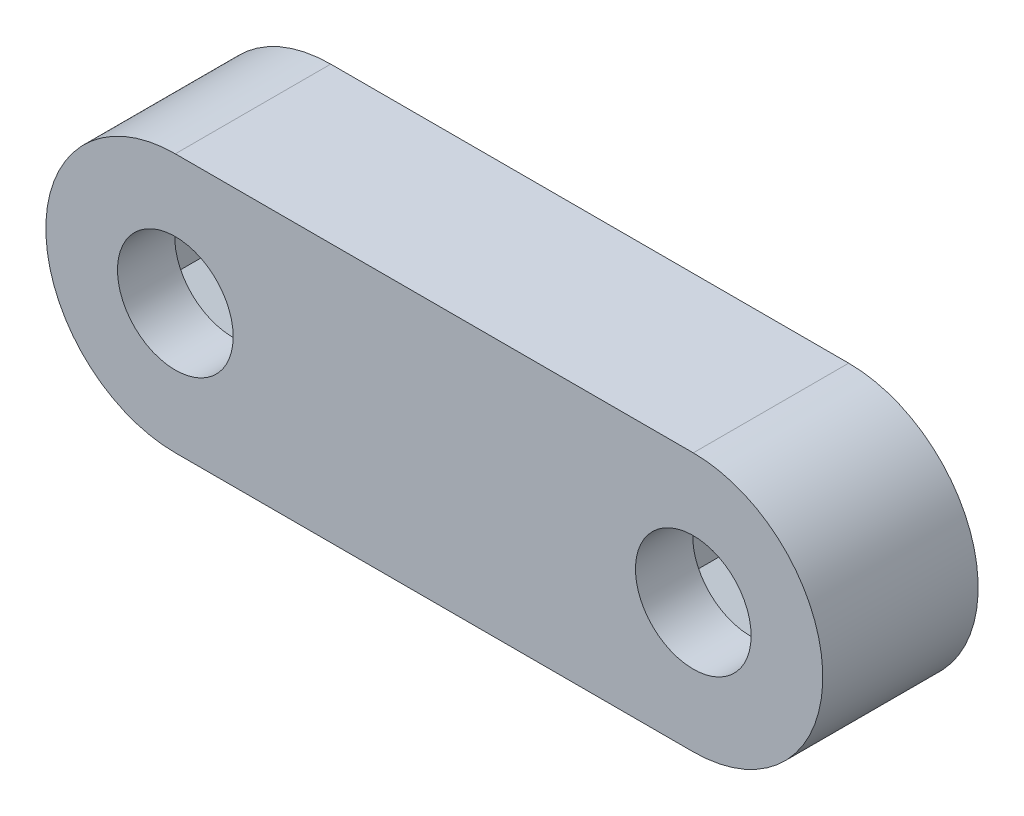
ISO-10303-21;
HEADER;
FILE_DESCRIPTION(('STEP AP214'),'2;1');
FILE_NAME('part.step','',(''),(''),'','','');
FILE_SCHEMA(('AUTOMOTIVE_DESIGN { 1 0 10303 214 1 1 1 1 }'));
ENDSEC;
DATA;
#1=APPLICATION_CONTEXT('core data for automotive mechanical design processes');
#2=APPLICATION_PROTOCOL_DEFINITION('international standard','automotive_design',2000,#1);
#3=PRODUCT_CONTEXT('',#1,'mechanical');
#4=PRODUCT('Part','Part','',(#3));
#5=PRODUCT_RELATED_PRODUCT_CATEGORY('part','',(#4));
#6=PRODUCT_DEFINITION_FORMATION('','',#4);
#7=PRODUCT_DEFINITION_CONTEXT('part definition',#1,'design');
#8=PRODUCT_DEFINITION('design','',#6,#7);
#9=PRODUCT_DEFINITION_SHAPE('','',#8);
#10=(LENGTH_UNIT() NAMED_UNIT(*) SI_UNIT(.MILLI.,.METRE.));
#11=(NAMED_UNIT(*) PLANE_ANGLE_UNIT() SI_UNIT($,.RADIAN.));
#12=(NAMED_UNIT(*) SI_UNIT($,.STERADIAN.) SOLID_ANGLE_UNIT());
#13=UNCERTAINTY_MEASURE_WITH_UNIT(LENGTH_MEASURE(1.E-05),#10,'distance_accuracy_value','');
#14=(GEOMETRIC_REPRESENTATION_CONTEXT(3) GLOBAL_UNCERTAINTY_ASSIGNED_CONTEXT((#13)) GLOBAL_UNIT_ASSIGNED_CONTEXT((#10,
#11,#12)) REPRESENTATION_CONTEXT('',''));
#15=CARTESIAN_POINT('',(0.,0.,0.));
#16=DIRECTION('',(0.,0.,1.));
#17=DIRECTION('',(1.,0.,0.));
#18=AXIS2_PLACEMENT_3D('',#15,#16,#17);
#19=CARTESIAN_POINT('',(22.25,19.1857894516248,18.));
#20=DIRECTION('',(-0.5,-0.866025403784439,0.));
#21=DIRECTION('',(0.866025403784439,-0.5,0.));
#22=AXIS2_PLACEMENT_3D('',#19,#20,#21);
#23=PLANE('',#22);
#24=DIRECTION('',(0.,0.,-1.));
#25=VECTOR('',#24,1.);
#26=CARTESIAN_POINT('',(22.25,19.1857894516248,18.));
#27=LINE('',#26,#25);
#28=CARTESIAN_POINT('',(22.25,19.1857894516248,11.37));
#29=VERTEX_POINT('',#28);
#30=CARTESIAN_POINT('',(22.25,19.1857894516248,5.6));
#31=VERTEX_POINT('',#30);
#32=EDGE_CURVE('E168',#29,#31,#27,.T.);
#33=ORIENTED_EDGE('',*,*,#32,.F.);
#34=DIRECTION('',(-0.866025403784439,0.5,0.));
#35=VECTOR('',#34,1.);
#36=CARTESIAN_POINT('',(22.25,19.1857894516248,11.37));
#37=LINE('',#36,#35);
#38=CARTESIAN_POINT('',(15.,23.3715789032496,11.37));
#39=VERTEX_POINT('',#38);
#40=EDGE_CURVE('E59',#29,#39,#37,.T.);
#41=ORIENTED_EDGE('',*,*,#40,.T.);
#42=DIRECTION('',(0.,0.,-1.));
#43=VECTOR('',#42,1.);
#44=CARTESIAN_POINT('',(15.,23.3715789032496,18.));
#45=LINE('',#44,#43);
#46=CARTESIAN_POINT('',(15.,23.3715789032496,5.6));
#47=VERTEX_POINT('',#46);
#48=EDGE_CURVE('E166',#39,#47,#45,.T.);
#49=ORIENTED_EDGE('',*,*,#48,.T.);
#50=DIRECTION('',(0.866025403784439,-0.5,0.));
#51=VECTOR('',#50,1.);
#52=CARTESIAN_POINT('',(22.25,19.1857894516248,5.6));
#53=LINE('',#52,#51);
#54=EDGE_CURVE('E230',#47,#31,#53,.T.);
#55=ORIENTED_EDGE('',*,*,#54,.T.);
#56=EDGE_LOOP('',(#33,#41,#49,#55));
#57=FACE_BOUND('',#56,.T.);
#58=ADVANCED_FACE('F44',(#57),#23,.T.);
#59=CARTESIAN_POINT('',(15.,23.3715789032496,18.));
#60=DIRECTION('',(0.5,-0.866025403784439,0.));
#61=DIRECTION('',(0.866025403784439,0.5,0.));
#62=AXIS2_PLACEMENT_3D('',#59,#60,#61);
#63=PLANE('',#62);
#64=ORIENTED_EDGE('',*,*,#48,.F.);
#65=DIRECTION('',(-0.866025403784439,-0.5,0.));
#66=VECTOR('',#65,1.);
#67=CARTESIAN_POINT('',(15.,23.3715789032496,11.37));
#68=LINE('',#67,#66);
#69=CARTESIAN_POINT('',(7.75,19.1857894516248,11.37));
#70=VERTEX_POINT('',#69);
#71=EDGE_CURVE('E154',#39,#70,#68,.T.);
#72=ORIENTED_EDGE('',*,*,#71,.T.);
#73=DIRECTION('',(0.,0.,-1.));
#74=VECTOR('',#73,1.);
#75=CARTESIAN_POINT('',(7.75,19.1857894516248,18.));
#76=LINE('',#75,#74);
#77=CARTESIAN_POINT('',(7.75,19.1857894516248,5.6));
#78=VERTEX_POINT('',#77);
#79=EDGE_CURVE('E176',#70,#78,#76,.T.);
#80=ORIENTED_EDGE('',*,*,#79,.T.);
#81=DIRECTION('',(0.866025403784439,0.5,0.));
#82=VECTOR('',#81,1.);
#83=CARTESIAN_POINT('',(15.,23.3715789032496,5.6));
#84=LINE('',#83,#82);
#85=EDGE_CURVE('E174',#78,#47,#84,.T.);
#86=ORIENTED_EDGE('',*,*,#85,.T.);
#87=EDGE_LOOP('',(#64,#72,#80,#86));
#88=FACE_BOUND('',#87,.T.);
#89=ADVANCED_FACE('F172',(#88),#63,.T.);
#90=CARTESIAN_POINT('',(7.75,19.1857894516248,18.));
#91=DIRECTION('',(1.,0.,0.));
#92=DIRECTION('',(0.,0.,-1.));
#93=AXIS2_PLACEMENT_3D('',#90,#91,#92);
#94=PLANE('',#93);
#95=ORIENTED_EDGE('',*,*,#79,.F.);
#96=DIRECTION('',(0.,-1.,0.));
#97=VECTOR('',#96,1.);
#98=CARTESIAN_POINT('',(7.75,19.1857894516248,11.37));
#99=LINE('',#98,#97);
#100=CARTESIAN_POINT('',(7.74999999999999,10.8142105483752,11.37));
#101=VERTEX_POINT('',#100);
#102=EDGE_CURVE('E158',#70,#101,#99,.T.);
#103=ORIENTED_EDGE('',*,*,#102,.T.);
#104=DIRECTION('',(0.,0.,-1.));
#105=VECTOR('',#104,1.);
#106=CARTESIAN_POINT('',(7.75,10.8142105483752,18.));
#107=LINE('',#106,#105);
#108=CARTESIAN_POINT('',(7.75,10.8142105483752,5.6));
#109=VERTEX_POINT('',#108);
#110=EDGE_CURVE('E181',#101,#109,#107,.T.);
#111=ORIENTED_EDGE('',*,*,#110,.T.);
#112=DIRECTION('',(0.,1.,0.));
#113=VECTOR('',#112,1.);
#114=CARTESIAN_POINT('',(7.75,19.1857894516248,5.6));
#115=LINE('',#114,#113);
#116=EDGE_CURVE('E253',#109,#78,#115,.T.);
#117=ORIENTED_EDGE('',*,*,#116,.T.);
#118=EDGE_LOOP('',(#95,#103,#111,#117));
#119=FACE_BOUND('',#118,.T.);
#120=ADVANCED_FACE('F252',(#119),#94,.T.);
#121=CARTESIAN_POINT('',(7.75,10.8142105483752,18.));
#122=DIRECTION('',(0.5,0.866025403784439,0.));
#123=DIRECTION('',(-0.866025403784439,0.5,0.));
#124=AXIS2_PLACEMENT_3D('',#121,#122,#123);
#125=PLANE('',#124);
#126=ORIENTED_EDGE('',*,*,#110,.F.);
#127=DIRECTION('',(0.866025403784439,-0.5,0.));
#128=VECTOR('',#127,1.);
#129=CARTESIAN_POINT('',(7.75,10.8142105483752,11.37));
#130=LINE('',#129,#128);
#131=CARTESIAN_POINT('',(15.,6.62842109675042,11.37));
#132=VERTEX_POINT('',#131);
#133=EDGE_CURVE('E314',#101,#132,#130,.T.);
#134=ORIENTED_EDGE('',*,*,#133,.T.);
#135=DIRECTION('',(0.,0.,-1.));
#136=VECTOR('',#135,1.);
#137=CARTESIAN_POINT('',(15.,6.62842109675042,18.));
#138=LINE('',#137,#136);
#139=CARTESIAN_POINT('',(15.,6.62842109675042,5.6));
#140=VERTEX_POINT('',#139);
#141=EDGE_CURVE('E247',#132,#140,#138,.T.);
#142=ORIENTED_EDGE('',*,*,#141,.T.);
#143=DIRECTION('',(-0.866025403784439,0.5,0.));
#144=VECTOR('',#143,1.);
#145=CARTESIAN_POINT('',(7.75,10.8142105483752,5.6));
#146=LINE('',#145,#144);
#147=EDGE_CURVE('E262',#140,#109,#146,.T.);
#148=ORIENTED_EDGE('',*,*,#147,.T.);
#149=EDGE_LOOP('',(#126,#134,#142,#148));
#150=FACE_BOUND('',#149,.T.);
#151=ADVANCED_FACE('F265',(#150),#125,.T.);
#152=CARTESIAN_POINT('',(15.,6.62842109675042,18.));
#153=DIRECTION('',(-0.5,0.866025403784438,0.));
#154=DIRECTION('',(-0.866025403784439,-0.5,0.));
#155=AXIS2_PLACEMENT_3D('',#152,#153,#154);
#156=PLANE('',#155);
#157=ORIENTED_EDGE('',*,*,#141,.F.);
#158=DIRECTION('',(0.866025403784439,0.5,0.));
#159=VECTOR('',#158,1.);
#160=CARTESIAN_POINT('',(15.,6.62842109675042,11.37));
#161=LINE('',#160,#159);
#162=CARTESIAN_POINT('',(22.25,10.8142105483752,11.37));
#163=VERTEX_POINT('',#162);
#164=EDGE_CURVE('E316',#132,#163,#161,.T.);
#165=ORIENTED_EDGE('',*,*,#164,.T.);
#166=DIRECTION('',(0.,0.,-1.));
#167=VECTOR('',#166,1.);
#168=CARTESIAN_POINT('',(22.25,10.8142105483752,18.));
#169=LINE('',#168,#167);
#170=CARTESIAN_POINT('',(22.25,10.8142105483752,5.6));
#171=VERTEX_POINT('',#170);
#172=EDGE_CURVE('E245',#163,#171,#169,.T.);
#173=ORIENTED_EDGE('',*,*,#172,.T.);
#174=DIRECTION('',(-0.866025403784439,-0.5,0.));
#175=VECTOR('',#174,1.);
#176=CARTESIAN_POINT('',(15.,6.62842109675042,5.6));
#177=LINE('',#176,#175);
#178=EDGE_CURVE('E267',#171,#140,#177,.T.);
#179=ORIENTED_EDGE('',*,*,#178,.T.);
#180=EDGE_LOOP('',(#157,#165,#173,#179));
#181=FACE_BOUND('',#180,.T.);
#182=ADVANCED_FACE('F355',(#181),#156,.T.);
#183=CARTESIAN_POINT('',(22.25,10.8142105483752,18.));
#184=DIRECTION('',(-1.,0.,0.));
#185=DIRECTION('',(0.,0.,1.));
#186=AXIS2_PLACEMENT_3D('',#183,#184,#185);
#187=PLANE('',#186);
#188=ORIENTED_EDGE('',*,*,#172,.F.);
#189=DIRECTION('',(0.,1.,0.));
#190=VECTOR('',#189,1.);
#191=CARTESIAN_POINT('',(22.25,10.8142105483752,11.37));
#192=LINE('',#191,#190);
#193=EDGE_CURVE('E11',#163,#29,#192,.T.);
#194=ORIENTED_EDGE('',*,*,#193,.T.);
#195=ORIENTED_EDGE('',*,*,#32,.T.);
#196=DIRECTION('',(0.,-1.,0.));
#197=VECTOR('',#196,1.);
#198=CARTESIAN_POINT('',(22.25,10.8142105483752,5.6));
#199=LINE('',#198,#197);
#200=EDGE_CURVE('E214',#31,#171,#199,.T.);
#201=ORIENTED_EDGE('',*,*,#200,.T.);
#202=EDGE_LOOP('',(#188,#194,#195,#201));
#203=FACE_BOUND('',#202,.T.);
#204=ADVANCED_FACE('F358',(#203),#187,.T.);
#205=CARTESIAN_POINT('',(82.25,19.1857894516248,18.));
#206=DIRECTION('',(-0.5,-0.866025403784438,0.));
#207=DIRECTION('',(0.866025403784438,-0.500000000000001,0.));
#208=AXIS2_PLACEMENT_3D('',#205,#206,#207);
#209=PLANE('',#208);
#210=DIRECTION('',(0.,0.,-1.));
#211=VECTOR('',#210,1.);
#212=CARTESIAN_POINT('',(82.25,19.1857894516248,18.));
#213=LINE('',#212,#211);
#214=CARTESIAN_POINT('',(82.25,19.1857894516248,11.37));
#215=VERTEX_POINT('',#214);
#216=CARTESIAN_POINT('',(82.25,19.1857894516248,5.6));
#217=VERTEX_POINT('',#216);
#218=EDGE_CURVE('E220',#215,#217,#213,.T.);
#219=ORIENTED_EDGE('',*,*,#218,.F.);
#220=DIRECTION('',(-0.866025403784438,0.500000000000001,0.));
#221=VECTOR('',#220,1.);
#222=CARTESIAN_POINT('',(82.25,19.1857894516248,11.37));
#223=LINE('',#222,#221);
#224=CARTESIAN_POINT('',(75.,23.3715789032496,11.37));
#225=VERTEX_POINT('',#224);
#226=EDGE_CURVE('E66',#215,#225,#223,.T.);
#227=ORIENTED_EDGE('',*,*,#226,.T.);
#228=DIRECTION('',(0.,0.,-1.));
#229=VECTOR('',#228,1.);
#230=CARTESIAN_POINT('',(75.,23.3715789032496,18.));
#231=LINE('',#230,#229);
#232=CARTESIAN_POINT('',(75.,23.3715789032496,5.6));
#233=VERTEX_POINT('',#232);
#234=EDGE_CURVE('E242',#225,#233,#231,.T.);
#235=ORIENTED_EDGE('',*,*,#234,.T.);
#236=DIRECTION('',(0.866025403784438,-0.500000000000001,0.));
#237=VECTOR('',#236,1.);
#238=CARTESIAN_POINT('',(82.25,19.1857894516248,5.6));
#239=LINE('',#238,#237);
#240=EDGE_CURVE('E229',#233,#217,#239,.T.);
#241=ORIENTED_EDGE('',*,*,#240,.T.);
#242=EDGE_LOOP('',(#219,#227,#235,#241));
#243=FACE_BOUND('',#242,.T.);
#244=ADVANCED_FACE('F226',(#243),#209,.T.);
#245=CARTESIAN_POINT('',(75.,23.3715789032496,18.));
#246=DIRECTION('',(0.5,-0.866025403784439,0.));
#247=DIRECTION('',(0.866025403784439,0.5,0.));
#248=AXIS2_PLACEMENT_3D('',#245,#246,#247);
#249=PLANE('',#248);
#250=ORIENTED_EDGE('',*,*,#234,.F.);
#251=DIRECTION('',(-0.866025403784439,-0.5,0.));
#252=VECTOR('',#251,1.);
#253=CARTESIAN_POINT('',(75.,23.3715789032496,11.37));
#254=LINE('',#253,#252);
#255=CARTESIAN_POINT('',(67.75,19.1857894516248,11.37));
#256=VERTEX_POINT('',#255);
#257=EDGE_CURVE('E297',#225,#256,#254,.T.);
#258=ORIENTED_EDGE('',*,*,#257,.T.);
#259=DIRECTION('',(0.,0.,-1.));
#260=VECTOR('',#259,1.);
#261=CARTESIAN_POINT('',(67.75,19.1857894516248,18.));
#262=LINE('',#261,#260);
#263=CARTESIAN_POINT('',(67.75,19.1857894516248,5.6));
#264=VERTEX_POINT('',#263);
#265=EDGE_CURVE('E240',#256,#264,#262,.T.);
#266=ORIENTED_EDGE('',*,*,#265,.T.);
#267=DIRECTION('',(0.866025403784439,0.5,0.));
#268=VECTOR('',#267,1.);
#269=CARTESIAN_POINT('',(75.,23.3715789032496,5.6));
#270=LINE('',#269,#268);
#271=EDGE_CURVE('E272',#264,#233,#270,.T.);
#272=ORIENTED_EDGE('',*,*,#271,.T.);
#273=EDGE_LOOP('',(#250,#258,#266,#272));
#274=FACE_BOUND('',#273,.T.);
#275=ADVANCED_FACE('F365',(#274),#249,.T.);
#276=CARTESIAN_POINT('',(67.75,19.1857894516248,18.));
#277=DIRECTION('',(1.,0.,0.));
#278=DIRECTION('',(0.,0.,-1.));
#279=AXIS2_PLACEMENT_3D('',#276,#277,#278);
#280=PLANE('',#279);
#281=ORIENTED_EDGE('',*,*,#265,.F.);
#282=DIRECTION('',(0.,-1.,0.));
#283=VECTOR('',#282,1.);
#284=CARTESIAN_POINT('',(67.75,19.1857894516248,11.37));
#285=LINE('',#284,#283);
#286=CARTESIAN_POINT('',(67.75,10.8142105483752,11.37));
#287=VERTEX_POINT('',#286);
#288=EDGE_CURVE('E300',#256,#287,#285,.T.);
#289=ORIENTED_EDGE('',*,*,#288,.T.);
#290=DIRECTION('',(0.,0.,-1.));
#291=VECTOR('',#290,1.);
#292=CARTESIAN_POINT('',(67.75,10.8142105483752,18.));
#293=LINE('',#292,#291);
#294=CARTESIAN_POINT('',(67.75,10.8142105483752,5.6));
#295=VERTEX_POINT('',#294);
#296=EDGE_CURVE('E238',#287,#295,#293,.T.);
#297=ORIENTED_EDGE('',*,*,#296,.T.);
#298=DIRECTION('',(0.,1.,0.));
#299=VECTOR('',#298,1.);
#300=CARTESIAN_POINT('',(67.75,19.1857894516248,5.6));
#301=LINE('',#300,#299);
#302=EDGE_CURVE('E275',#295,#264,#301,.T.);
#303=ORIENTED_EDGE('',*,*,#302,.T.);
#304=EDGE_LOOP('',(#281,#289,#297,#303));
#305=FACE_BOUND('',#304,.T.);
#306=ADVANCED_FACE('F368',(#305),#280,.T.);
#307=CARTESIAN_POINT('',(67.75,10.8142105483752,18.));
#308=DIRECTION('',(0.5,0.866025403784439,0.));
#309=DIRECTION('',(-0.866025403784439,0.5,0.));
#310=AXIS2_PLACEMENT_3D('',#307,#308,#309);
#311=PLANE('',#310);
#312=ORIENTED_EDGE('',*,*,#296,.F.);
#313=DIRECTION('',(0.866025403784439,-0.5,0.));
#314=VECTOR('',#313,1.);
#315=CARTESIAN_POINT('',(67.75,10.8142105483752,11.37));
#316=LINE('',#315,#314);
#317=CARTESIAN_POINT('',(75.,6.62842109675042,11.37));
#318=VERTEX_POINT('',#317);
#319=EDGE_CURVE('E303',#287,#318,#316,.T.);
#320=ORIENTED_EDGE('',*,*,#319,.T.);
#321=DIRECTION('',(0.,0.,-1.));
#322=VECTOR('',#321,1.);
#323=CARTESIAN_POINT('',(75.,6.62842109675042,18.));
#324=LINE('',#323,#322);
#325=CARTESIAN_POINT('',(75.,6.62842109675042,5.6));
#326=VERTEX_POINT('',#325);
#327=EDGE_CURVE('E232',#318,#326,#324,.T.);
#328=ORIENTED_EDGE('',*,*,#327,.T.);
#329=DIRECTION('',(-0.866025403784439,0.5,0.));
#330=VECTOR('',#329,1.);
#331=CARTESIAN_POINT('',(67.75,10.8142105483752,5.6));
#332=LINE('',#331,#330);
#333=EDGE_CURVE('E278',#326,#295,#332,.T.);
#334=ORIENTED_EDGE('',*,*,#333,.T.);
#335=EDGE_LOOP('',(#312,#320,#328,#334));
#336=FACE_BOUND('',#335,.T.);
#337=ADVANCED_FACE('F372',(#336),#311,.T.);
#338=CARTESIAN_POINT('',(75.,6.62842109675042,18.));
#339=DIRECTION('',(-0.5,0.866025403784438,0.));
#340=DIRECTION('',(-0.866025403784438,-0.500000000000001,0.));
#341=AXIS2_PLACEMENT_3D('',#338,#339,#340);
#342=PLANE('',#341);
#343=ORIENTED_EDGE('',*,*,#327,.F.);
#344=DIRECTION('',(0.866025403784438,0.500000000000001,0.));
#345=VECTOR('',#344,1.);
#346=CARTESIAN_POINT('',(75.,6.62842109675042,11.37));
#347=LINE('',#346,#345);
#348=CARTESIAN_POINT('',(82.25,10.8142105483752,11.37));
#349=VERTEX_POINT('',#348);
#350=EDGE_CURVE('E306',#318,#349,#347,.T.);
#351=ORIENTED_EDGE('',*,*,#350,.T.);
#352=DIRECTION('',(0.,0.,-1.));
#353=VECTOR('',#352,1.);
#354=CARTESIAN_POINT('',(82.25,10.8142105483752,18.));
#355=LINE('',#354,#353);
#356=CARTESIAN_POINT('',(82.25,10.8142105483752,5.6));
#357=VERTEX_POINT('',#356);
#358=EDGE_CURVE('E222',#349,#357,#355,.T.);
#359=ORIENTED_EDGE('',*,*,#358,.T.);
#360=DIRECTION('',(-0.866025403784438,-0.500000000000001,0.));
#361=VECTOR('',#360,1.);
#362=CARTESIAN_POINT('',(75.,6.62842109675042,5.6));
#363=LINE('',#362,#361);
#364=EDGE_CURVE('E281',#357,#326,#363,.T.);
#365=ORIENTED_EDGE('',*,*,#364,.T.);
#366=EDGE_LOOP('',(#343,#351,#359,#365));
#367=FACE_BOUND('',#366,.T.);
#368=ADVANCED_FACE('F341',(#367),#342,.T.);
#369=CARTESIAN_POINT('',(82.25,10.8142105483752,18.));
#370=DIRECTION('',(-1.,0.,0.));
#371=DIRECTION('',(0.,0.,1.));
#372=AXIS2_PLACEMENT_3D('',#369,#370,#371);
#373=PLANE('',#372);
#374=ORIENTED_EDGE('',*,*,#358,.F.);
#375=DIRECTION('',(0.,1.,0.));
#376=VECTOR('',#375,1.);
#377=CARTESIAN_POINT('',(82.25,10.8142105483752,11.37));
#378=LINE('',#377,#376);
#379=EDGE_CURVE('E52',#349,#215,#378,.T.);
#380=ORIENTED_EDGE('',*,*,#379,.T.);
#381=ORIENTED_EDGE('',*,*,#218,.T.);
#382=DIRECTION('',(0.,-1.,0.));
#383=VECTOR('',#382,1.);
#384=CARTESIAN_POINT('',(82.25,10.8142105483752,5.6));
#385=LINE('',#384,#383);
#386=EDGE_CURVE('E211',#217,#357,#385,.T.);
#387=ORIENTED_EDGE('',*,*,#386,.T.);
#388=EDGE_LOOP('',(#374,#380,#381,#387));
#389=FACE_BOUND('',#388,.T.);
#390=ADVANCED_FACE('F219',(#389),#373,.T.);
#391=CARTESIAN_POINT('',(75.,15.,18.));
#392=DIRECTION('',(0.,0.,1.));
#393=DIRECTION('',(1.,0.,0.));
#394=AXIS2_PLACEMENT_3D('',#391,#392,#393);
#395=PLANE('',#394);
#396=CARTESIAN_POINT('',(75.,15.,18.));
#397=DIRECTION('',(0.,0.,1.));
#398=DIRECTION('',(1.,0.,0.));
#399=AXIS2_PLACEMENT_3D('',#396,#397,#398);
#400=CIRCLE('',#399,15.);
#401=CARTESIAN_POINT('',(75.,0.,18.));
#402=VERTEX_POINT('',#401);
#403=CARTESIAN_POINT('',(75.,30.,18.));
#404=VERTEX_POINT('',#403);
#405=EDGE_CURVE('E185',#402,#404,#400,.T.);
#406=ORIENTED_EDGE('',*,*,#405,.T.);
#407=DIRECTION('',(-1.,0.,0.));
#408=VECTOR('',#407,1.);
#409=CARTESIAN_POINT('',(15.,30.,18.));
#410=LINE('',#409,#408);
#411=CARTESIAN_POINT('',(15.,30.,18.));
#412=VERTEX_POINT('',#411);
#413=EDGE_CURVE('E188',#404,#412,#410,.T.);
#414=ORIENTED_EDGE('',*,*,#413,.T.);
#415=CARTESIAN_POINT('',(15.,15.,18.));
#416=DIRECTION('',(0.,0.,1.));
#417=DIRECTION('',(1.,0.,0.));
#418=AXIS2_PLACEMENT_3D('',#415,#416,#417);
#419=CIRCLE('',#418,15.);
#420=CARTESIAN_POINT('',(15.,0.,18.));
#421=VERTEX_POINT('',#420);
#422=EDGE_CURVE('E191',#412,#421,#419,.T.);
#423=ORIENTED_EDGE('',*,*,#422,.T.);
#424=DIRECTION('',(1.,0.,0.));
#425=VECTOR('',#424,1.);
#426=CARTESIAN_POINT('',(15.,0.,18.));
#427=LINE('',#426,#425);
#428=EDGE_CURVE('E193',#421,#402,#427,.T.);
#429=ORIENTED_EDGE('',*,*,#428,.T.);
#430=EDGE_LOOP('',(#406,#414,#423,#429));
#431=FACE_BOUND('',#430,.T.);
#432=CARTESIAN_POINT('',(75.,15.,18.));
#433=DIRECTION('',(0.,0.,1.));
#434=DIRECTION('',(1.,0.,0.));
#435=AXIS2_PLACEMENT_3D('',#432,#433,#434);
#436=CIRCLE('',#435,6.7);
#437=CARTESIAN_POINT('',(81.7,15.,18.));
#438=VERTEX_POINT('',#437);
#439=EDGE_CURVE('E169',#438,#438,#436,.T.);
#440=ORIENTED_EDGE('',*,*,#439,.F.);
#441=EDGE_LOOP('',(#440));
#442=FACE_BOUND('',#441,.T.);
#443=CARTESIAN_POINT('',(15.,15.,18.));
#444=DIRECTION('',(0.,0.,1.));
#445=DIRECTION('',(1.,0.,0.));
#446=AXIS2_PLACEMENT_3D('',#443,#444,#445);
#447=CIRCLE('',#446,6.7);
#448=CARTESIAN_POINT('',(21.7,15.,18.));
#449=VERTEX_POINT('',#448);
#450=EDGE_CURVE('E319',#449,#449,#447,.T.);
#451=ORIENTED_EDGE('',*,*,#450,.F.);
#452=EDGE_LOOP('',(#451));
#453=FACE_BOUND('',#452,.T.);
#454=ADVANCED_FACE('F328',(#431,#442,#453),#395,.T.);
#455=CARTESIAN_POINT('',(75.,15.,0.));
#456=DIRECTION('',(0.,0.,1.));
#457=DIRECTION('',(1.,0.,0.));
#458=AXIS2_PLACEMENT_3D('',#455,#456,#457);
#459=PLANE('',#458);
#460=CARTESIAN_POINT('',(75.,15.,0.));
#461=DIRECTION('',(0.,0.,-1.));
#462=DIRECTION('',(-1.,0.,0.));
#463=AXIS2_PLACEMENT_3D('',#460,#461,#462);
#464=CIRCLE('',#463,9.99999999999999);
#465=CARTESIAN_POINT('',(65.,15.,0.));
#466=VERTEX_POINT('',#465);
#467=EDGE_CURVE('E291',#466,#466,#464,.T.);
#468=ORIENTED_EDGE('',*,*,#467,.F.);
#469=EDGE_LOOP('',(#468));
#470=FACE_BOUND('',#469,.T.);
#471=CARTESIAN_POINT('',(15.,15.,0.));
#472=DIRECTION('',(0.,0.,-1.));
#473=DIRECTION('',(-1.,0.,0.));
#474=AXIS2_PLACEMENT_3D('',#471,#472,#473);
#475=CIRCLE('',#474,10.);
#476=CARTESIAN_POINT('',(4.99999999999999,15.,0.));
#477=VERTEX_POINT('',#476);
#478=EDGE_CURVE('E288',#477,#477,#475,.T.);
#479=ORIENTED_EDGE('',*,*,#478,.F.);
#480=EDGE_LOOP('',(#479));
#481=FACE_BOUND('',#480,.T.);
#482=CARTESIAN_POINT('',(75.,15.,0.));
#483=DIRECTION('',(0.,0.,1.));
#484=DIRECTION('',(1.,0.,0.));
#485=AXIS2_PLACEMENT_3D('',#482,#483,#484);
#486=CIRCLE('',#485,15.);
#487=CARTESIAN_POINT('',(75.,0.,0.));
#488=VERTEX_POINT('',#487);
#489=CARTESIAN_POINT('',(75.,30.,0.));
#490=VERTEX_POINT('',#489);
#491=EDGE_CURVE('E175',#488,#490,#486,.T.);
#492=ORIENTED_EDGE('',*,*,#491,.F.);
#493=DIRECTION('',(1.,0.,0.));
#494=VECTOR('',#493,1.);
#495=CARTESIAN_POINT('',(15.,0.,0.));
#496=LINE('',#495,#494);
#497=CARTESIAN_POINT('',(15.,0.,0.));
#498=VERTEX_POINT('',#497);
#499=EDGE_CURVE('E189',#498,#488,#496,.T.);
#500=ORIENTED_EDGE('',*,*,#499,.F.);
#501=CARTESIAN_POINT('',(15.,15.,0.));
#502=DIRECTION('',(0.,0.,1.));
#503=DIRECTION('',(1.,0.,0.));
#504=AXIS2_PLACEMENT_3D('',#501,#502,#503);
#505=CIRCLE('',#504,15.);
#506=CARTESIAN_POINT('',(15.,30.,0.));
#507=VERTEX_POINT('',#506);
#508=EDGE_CURVE('E197',#507,#498,#505,.T.);
#509=ORIENTED_EDGE('',*,*,#508,.F.);
#510=DIRECTION('',(-1.,0.,0.));
#511=VECTOR('',#510,1.);
#512=CARTESIAN_POINT('',(15.,30.,0.));
#513=LINE('',#512,#511);
#514=EDGE_CURVE('E179',#490,#507,#513,.T.);
#515=ORIENTED_EDGE('',*,*,#514,.F.);
#516=EDGE_LOOP('',(#492,#500,#509,#515));
#517=FACE_BOUND('',#516,.T.);
#518=ADVANCED_FACE('F330',(#470,#481,#517),#459,.F.);
#519=CARTESIAN_POINT('',(75.,15.,18.));
#520=DIRECTION('',(0.,0.,-1.));
#521=DIRECTION('',(-1.,0.,0.));
#522=AXIS2_PLACEMENT_3D('',#519,#520,#521);
#523=CYLINDRICAL_SURFACE('',#522,15.);
#524=ORIENTED_EDGE('',*,*,#491,.T.);
#525=DIRECTION('',(0.,0.,-1.));
#526=VECTOR('',#525,1.);
#527=CARTESIAN_POINT('',(75.,30.,18.));
#528=LINE('',#527,#526);
#529=EDGE_CURVE('E208',#404,#490,#528,.T.);
#530=ORIENTED_EDGE('',*,*,#529,.F.);
#531=ORIENTED_EDGE('',*,*,#405,.F.);
#532=DIRECTION('',(0.,0.,-1.));
#533=VECTOR('',#532,1.);
#534=CARTESIAN_POINT('',(75.,0.,18.));
#535=LINE('',#534,#533);
#536=EDGE_CURVE('E194',#402,#488,#535,.T.);
#537=ORIENTED_EDGE('',*,*,#536,.T.);
#538=EDGE_LOOP('',(#524,#530,#531,#537));
#539=FACE_BOUND('',#538,.T.);
#540=ADVANCED_FACE('F46',(#539),#523,.T.);
#541=CARTESIAN_POINT('',(15.,30.,18.));
#542=DIRECTION('',(0.,-1.,0.));
#543=DIRECTION('',(1.,0.,0.));
#544=AXIS2_PLACEMENT_3D('',#541,#542,#543);
#545=PLANE('',#544);
#546=ORIENTED_EDGE('',*,*,#514,.T.);
#547=DIRECTION('',(0.,0.,-1.));
#548=VECTOR('',#547,1.);
#549=CARTESIAN_POINT('',(15.,30.,18.));
#550=LINE('',#549,#548);
#551=EDGE_CURVE('E205',#412,#507,#550,.T.);
#552=ORIENTED_EDGE('',*,*,#551,.F.);
#553=ORIENTED_EDGE('',*,*,#413,.F.);
#554=ORIENTED_EDGE('',*,*,#529,.T.);
#555=EDGE_LOOP('',(#546,#552,#553,#554));
#556=FACE_BOUND('',#555,.T.);
#557=ADVANCED_FACE('F528',(#556),#545,.F.);
#558=CARTESIAN_POINT('',(15.,15.,18.));
#559=DIRECTION('',(0.,0.,-1.));
#560=DIRECTION('',(-1.,0.,0.));
#561=AXIS2_PLACEMENT_3D('',#558,#559,#560);
#562=CYLINDRICAL_SURFACE('',#561,15.);
#563=ORIENTED_EDGE('',*,*,#508,.T.);
#564=DIRECTION('',(0.,0.,-1.));
#565=VECTOR('',#564,1.);
#566=CARTESIAN_POINT('',(15.,0.,18.));
#567=LINE('',#566,#565);
#568=EDGE_CURVE('E202',#421,#498,#567,.T.);
#569=ORIENTED_EDGE('',*,*,#568,.F.);
#570=ORIENTED_EDGE('',*,*,#422,.F.);
#571=ORIENTED_EDGE('',*,*,#551,.T.);
#572=EDGE_LOOP('',(#563,#569,#570,#571));
#573=FACE_BOUND('',#572,.T.);
#574=ADVANCED_FACE('F538',(#573),#562,.T.);
#575=CARTESIAN_POINT('',(15.,0.,18.));
#576=DIRECTION('',(0.,1.,0.));
#577=DIRECTION('',(-1.,0.,0.));
#578=AXIS2_PLACEMENT_3D('',#575,#576,#577);
#579=PLANE('',#578);
#580=ORIENTED_EDGE('',*,*,#499,.T.);
#581=ORIENTED_EDGE('',*,*,#536,.F.);
#582=ORIENTED_EDGE('',*,*,#428,.F.);
#583=ORIENTED_EDGE('',*,*,#568,.T.);
#584=EDGE_LOOP('',(#580,#581,#582,#583));
#585=FACE_BOUND('',#584,.T.);
#586=ADVANCED_FACE('F391',(#585),#579,.F.);
#587=CARTESIAN_POINT('',(75.,15.,5.6));
#588=DIRECTION('',(0.,0.,-1.));
#589=DIRECTION('',(-1.,0.,0.));
#590=AXIS2_PLACEMENT_3D('',#587,#588,#589);
#591=CYLINDRICAL_SURFACE('',#590,9.99999999999999);
#592=CARTESIAN_POINT('',(75.,15.,5.6));
#593=DIRECTION('',(0.,0.,-1.));
#594=DIRECTION('',(-1.,0.,0.));
#595=AXIS2_PLACEMENT_3D('',#592,#593,#594);
#596=CIRCLE('',#595,9.99999999999999);
#597=CARTESIAN_POINT('',(65.,15.,5.6));
#598=VERTEX_POINT('',#597);
#599=EDGE_CURVE('E284',#598,#598,#596,.T.);
#600=ORIENTED_EDGE('',*,*,#599,.F.);
#601=EDGE_LOOP('',(#600));
#602=FACE_BOUND('',#601,.T.);
#603=ORIENTED_EDGE('',*,*,#467,.T.);
#604=EDGE_LOOP('',(#603));
#605=FACE_BOUND('',#604,.T.);
#606=ADVANCED_FACE('F388',(#602,#605),#591,.F.);
#607=CARTESIAN_POINT('',(75.,15.,5.6));
#608=DIRECTION('',(0.,0.,-1.));
#609=DIRECTION('',(-1.,0.,0.));
#610=AXIS2_PLACEMENT_3D('',#607,#608,#609);
#611=PLANE('',#610);
#612=ORIENTED_EDGE('',*,*,#271,.F.);
#613=ORIENTED_EDGE('',*,*,#302,.F.);
#614=ORIENTED_EDGE('',*,*,#333,.F.);
#615=ORIENTED_EDGE('',*,*,#364,.F.);
#616=ORIENTED_EDGE('',*,*,#386,.F.);
#617=ORIENTED_EDGE('',*,*,#240,.F.);
#618=EDGE_LOOP('',(#612,#613,#614,#615,#616,#617));
#619=FACE_BOUND('',#618,.T.);
#620=ORIENTED_EDGE('',*,*,#599,.T.);
#621=EDGE_LOOP('',(#620));
#622=FACE_BOUND('',#621,.T.);
#623=ADVANCED_FACE('F386',(#619,#622),#611,.T.);
#624=CARTESIAN_POINT('',(15.,15.,5.6));
#625=DIRECTION('',(0.,0.,-1.));
#626=DIRECTION('',(-1.,0.,0.));
#627=AXIS2_PLACEMENT_3D('',#624,#625,#626);
#628=CYLINDRICAL_SURFACE('',#627,10.);
#629=CARTESIAN_POINT('',(15.,15.,5.6));
#630=DIRECTION('',(0.,0.,-1.));
#631=DIRECTION('',(-1.,0.,0.));
#632=AXIS2_PLACEMENT_3D('',#629,#630,#631);
#633=CIRCLE('',#632,10.);
#634=CARTESIAN_POINT('',(4.99999999999999,15.,5.6));
#635=VERTEX_POINT('',#634);
#636=EDGE_CURVE('E285',#635,#635,#633,.T.);
#637=ORIENTED_EDGE('',*,*,#636,.F.);
#638=EDGE_LOOP('',(#637));
#639=FACE_BOUND('',#638,.T.);
#640=ORIENTED_EDGE('',*,*,#478,.T.);
#641=EDGE_LOOP('',(#640));
#642=FACE_BOUND('',#641,.T.);
#643=ADVANCED_FACE('F383',(#639,#642),#628,.F.);
#644=CARTESIAN_POINT('',(15.,15.,5.6));
#645=DIRECTION('',(0.,0.,-1.));
#646=DIRECTION('',(-1.,0.,0.));
#647=AXIS2_PLACEMENT_3D('',#644,#645,#646);
#648=PLANE('',#647);
#649=ORIENTED_EDGE('',*,*,#85,.F.);
#650=ORIENTED_EDGE('',*,*,#116,.F.);
#651=ORIENTED_EDGE('',*,*,#147,.F.);
#652=ORIENTED_EDGE('',*,*,#178,.F.);
#653=ORIENTED_EDGE('',*,*,#200,.F.);
#654=ORIENTED_EDGE('',*,*,#54,.F.);
#655=EDGE_LOOP('',(#649,#650,#651,#652,#653,#654));
#656=FACE_BOUND('',#655,.T.);
#657=ORIENTED_EDGE('',*,*,#636,.T.);
#658=EDGE_LOOP('',(#657));
#659=FACE_BOUND('',#658,.T.);
#660=ADVANCED_FACE('F259',(#656,#659),#648,.T.);
#661=CARTESIAN_POINT('',(75.,15.,11.37));
#662=DIRECTION('',(0.,0.,1.));
#663=DIRECTION('',(1.,0.,0.));
#664=AXIS2_PLACEMENT_3D('',#661,#662,#663);
#665=PLANE('',#664);
#666=ORIENTED_EDGE('',*,*,#226,.F.);
#667=ORIENTED_EDGE('',*,*,#379,.F.);
#668=ORIENTED_EDGE('',*,*,#350,.F.);
#669=ORIENTED_EDGE('',*,*,#319,.F.);
#670=ORIENTED_EDGE('',*,*,#288,.F.);
#671=ORIENTED_EDGE('',*,*,#257,.F.);
#672=EDGE_LOOP('',(#666,#667,#668,#669,#670,#671));
#673=FACE_BOUND('',#672,.T.);
#674=CARTESIAN_POINT('',(75.,15.,11.37));
#675=DIRECTION('',(0.,0.,1.));
#676=DIRECTION('',(1.,0.,0.));
#677=AXIS2_PLACEMENT_3D('',#674,#675,#676);
#678=CIRCLE('',#677,6.7);
#679=CARTESIAN_POINT('',(81.7,15.,11.37));
#680=VERTEX_POINT('',#679);
#681=EDGE_CURVE('E308',#680,#680,#678,.T.);
#682=ORIENTED_EDGE('',*,*,#681,.T.);
#683=EDGE_LOOP('',(#682));
#684=FACE_BOUND('',#683,.T.);
#685=ADVANCED_FACE('F382',(#673,#684),#665,.F.);
#686=CARTESIAN_POINT('',(75.,15.,11.37));
#687=DIRECTION('',(0.,0.,1.));
#688=DIRECTION('',(1.,0.,0.));
#689=AXIS2_PLACEMENT_3D('',#686,#687,#688);
#690=CYLINDRICAL_SURFACE('',#689,6.7);
#691=ORIENTED_EDGE('',*,*,#681,.F.);
#692=EDGE_LOOP('',(#691));
#693=FACE_BOUND('',#692,.T.);
#694=ORIENTED_EDGE('',*,*,#439,.T.);
#695=EDGE_LOOP('',(#694));
#696=FACE_BOUND('',#695,.T.);
#697=ADVANCED_FACE('F397',(#693,#696),#690,.F.);
#698=CARTESIAN_POINT('',(15.,15.,11.37));
#699=DIRECTION('',(0.,0.,1.));
#700=DIRECTION('',(1.,0.,0.));
#701=AXIS2_PLACEMENT_3D('',#698,#699,#700);
#702=PLANE('',#701);
#703=ORIENTED_EDGE('',*,*,#40,.F.);
#704=ORIENTED_EDGE('',*,*,#193,.F.);
#705=ORIENTED_EDGE('',*,*,#164,.F.);
#706=ORIENTED_EDGE('',*,*,#133,.F.);
#707=ORIENTED_EDGE('',*,*,#102,.F.);
#708=ORIENTED_EDGE('',*,*,#71,.F.);
#709=EDGE_LOOP('',(#703,#704,#705,#706,#707,#708));
#710=FACE_BOUND('',#709,.T.);
#711=CARTESIAN_POINT('',(15.,15.,11.37));
#712=DIRECTION('',(0.,0.,1.));
#713=DIRECTION('',(1.,0.,0.));
#714=AXIS2_PLACEMENT_3D('',#711,#712,#713);
#715=CIRCLE('',#714,6.7);
#716=CARTESIAN_POINT('',(21.7,15.,11.37));
#717=VERTEX_POINT('',#716);
#718=EDGE_CURVE('E320',#717,#717,#715,.T.);
#719=ORIENTED_EDGE('',*,*,#718,.T.);
#720=EDGE_LOOP('',(#719));
#721=FACE_BOUND('',#720,.T.);
#722=ADVANCED_FACE('F155',(#710,#721),#702,.F.);
#723=CARTESIAN_POINT('',(15.,15.,11.37));
#724=DIRECTION('',(0.,0.,1.));
#725=DIRECTION('',(1.,0.,0.));
#726=AXIS2_PLACEMENT_3D('',#723,#724,#725);
#727=CYLINDRICAL_SURFACE('',#726,6.7);
#728=ORIENTED_EDGE('',*,*,#718,.F.);
#729=EDGE_LOOP('',(#728));
#730=FACE_BOUND('',#729,.T.);
#731=ORIENTED_EDGE('',*,*,#450,.T.);
#732=EDGE_LOOP('',(#731));
#733=FACE_BOUND('',#732,.T.);
#734=ADVANCED_FACE('F326',(#730,#733),#727,.F.);
#735=CLOSED_SHELL('',(#58,#89,#120,#151,#182,#204,#244,#275,#306,#337,#368,#390,#454,#518,#540,
#557,#574,#586,#606,#623,#643,#660,#685,#697,#722,#734));
#736=MANIFOLD_SOLID_BREP('B2',#735);
#737=ADVANCED_BREP_SHAPE_REPRESENTATION('',(#18,#736),#14);
#738=SHAPE_DEFINITION_REPRESENTATION(#9,#737);
ENDSEC;
END-ISO-10303-21;
